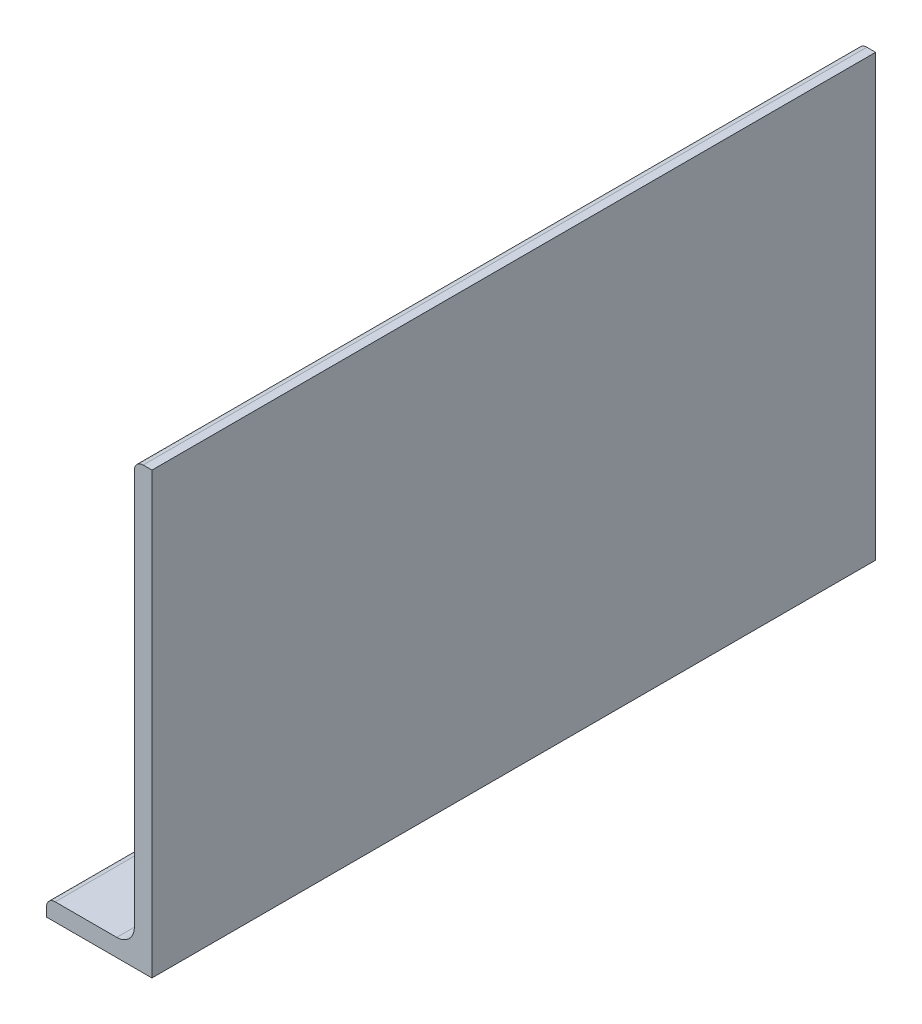
ISO-10303-21;
HEADER;
FILE_DESCRIPTION(('STEP AP214'),'2;1');
FILE_NAME('part.step','',(''),(''),'','','');
FILE_SCHEMA(('AUTOMOTIVE_DESIGN { 1 0 10303 214 1 1 1 1 }'));
ENDSEC;
DATA;
#1=APPLICATION_CONTEXT('core data for automotive mechanical design processes');
#2=APPLICATION_PROTOCOL_DEFINITION('international standard','automotive_design',2000,#1);
#3=PRODUCT_CONTEXT('',#1,'mechanical');
#4=PRODUCT('Part','Part','',(#3));
#5=PRODUCT_RELATED_PRODUCT_CATEGORY('part','',(#4));
#6=PRODUCT_DEFINITION_FORMATION('','',#4);
#7=PRODUCT_DEFINITION_CONTEXT('part definition',#1,'design');
#8=PRODUCT_DEFINITION('design','',#6,#7);
#9=PRODUCT_DEFINITION_SHAPE('','',#8);
#10=(LENGTH_UNIT() NAMED_UNIT(*) SI_UNIT(.MILLI.,.METRE.));
#11=(NAMED_UNIT(*) PLANE_ANGLE_UNIT() SI_UNIT($,.RADIAN.));
#12=(NAMED_UNIT(*) SI_UNIT($,.STERADIAN.) SOLID_ANGLE_UNIT());
#13=UNCERTAINTY_MEASURE_WITH_UNIT(LENGTH_MEASURE(1.E-05),#10,'distance_accuracy_value','');
#14=(GEOMETRIC_REPRESENTATION_CONTEXT(3) GLOBAL_UNCERTAINTY_ASSIGNED_CONTEXT((#13)) GLOBAL_UNIT_ASSIGNED_CONTEXT((#10,
#11,#12)) REPRESENTATION_CONTEXT('',''));
#15=CARTESIAN_POINT('',(0.,0.,0.));
#16=DIRECTION('',(0.,0.,1.));
#17=DIRECTION('',(1.,0.,0.));
#18=AXIS2_PLACEMENT_3D('',#15,#16,#17);
#19=CARTESIAN_POINT('',(466.753002522153,-2.51221530905127,82.26));
#20=DIRECTION('',(0.,-1.,0.));
#21=DIRECTION('',(0.,0.,-1.));
#22=AXIS2_PLACEMENT_3D('',#19,#20,#21);
#23=PLANE('',#22);
#24=DIRECTION('',(-1.,0.,0.));
#25=VECTOR('',#24,1.);
#26=CARTESIAN_POINT('',(466.753002522153,-2.51221530905127,0.));
#27=LINE('',#26,#25);
#28=CARTESIAN_POINT('',(468.753002522153,-2.51221530905127,0.));
#29=VERTEX_POINT('',#28);
#30=CARTESIAN_POINT('',(467.753002522153,-2.51221530905127,0.));
#31=VERTEX_POINT('',#30);
#32=EDGE_CURVE('E135',#29,#31,#27,.T.);
#33=ORIENTED_EDGE('',*,*,#32,.T.);
#34=DIRECTION('',(0.,0.,-1.));
#35=VECTOR('',#34,1.);
#36=CARTESIAN_POINT('',(467.753002522153,-2.51221530905127,82.26));
#37=LINE('',#36,#35);
#38=CARTESIAN_POINT('',(467.753002522153,-2.51221530905127,82.26));
#39=VERTEX_POINT('',#38);
#40=EDGE_CURVE('E167',#31,#39,#37,.F.);
#41=ORIENTED_EDGE('',*,*,#40,.T.);
#42=DIRECTION('',(-1.,0.,0.));
#43=VECTOR('',#42,1.);
#44=CARTESIAN_POINT('',(466.753002522153,-2.51221530905127,82.26));
#45=LINE('',#44,#43);
#46=CARTESIAN_POINT('',(468.753002522153,-2.51221530905127,82.26));
#47=VERTEX_POINT('',#46);
#48=EDGE_CURVE('E148',#47,#39,#45,.T.);
#49=ORIENTED_EDGE('',*,*,#48,.F.);
#50=DIRECTION('',(0.,0.,-1.));
#51=VECTOR('',#50,1.);
#52=CARTESIAN_POINT('',(468.753002522153,-2.51221530905127,82.26));
#53=LINE('',#52,#51);
#54=EDGE_CURVE('E131',#47,#29,#53,.T.);
#55=ORIENTED_EDGE('',*,*,#54,.T.);
#56=EDGE_LOOP('',(#33,#41,#49,#55));
#57=FACE_BOUND('',#56,.T.);
#58=ADVANCED_FACE('F33',(#57),#23,.F.);
#59=CARTESIAN_POINT('',(466.753002522153,-50.5122153090513,82.26));
#60=DIRECTION('',(1.,0.,0.));
#61=DIRECTION('',(0.,0.,-1.));
#62=AXIS2_PLACEMENT_3D('',#59,#60,#61);
#63=PLANE('',#62);
#64=DIRECTION('',(0.,-1.,0.));
#65=VECTOR('',#64,1.);
#66=CARTESIAN_POINT('',(466.753002522153,-50.5122153090513,0.));
#67=LINE('',#66,#65);
#68=CARTESIAN_POINT('',(466.753002522153,-3.51221530905127,0.));
#69=VERTEX_POINT('',#68);
#70=CARTESIAN_POINT('',(466.753002522153,-48.5122153090513,0.));
#71=VERTEX_POINT('',#70);
#72=EDGE_CURVE('E138',#69,#71,#67,.T.);
#73=ORIENTED_EDGE('',*,*,#72,.T.);
#74=DIRECTION('',(0.,0.,-1.));
#75=VECTOR('',#74,1.);
#76=CARTESIAN_POINT('',(466.753002522153,-48.5122153090513,82.26));
#77=LINE('',#76,#75);
#78=CARTESIAN_POINT('',(466.753002522153,-48.5122153090513,82.26));
#79=VERTEX_POINT('',#78);
#80=EDGE_CURVE('E54',#71,#79,#77,.F.);
#81=ORIENTED_EDGE('',*,*,#80,.T.);
#82=DIRECTION('',(0.,-1.,0.));
#83=VECTOR('',#82,1.);
#84=CARTESIAN_POINT('',(466.753002522153,-50.5122153090513,82.26));
#85=LINE('',#84,#83);
#86=CARTESIAN_POINT('',(466.753002522153,-3.51221530905127,82.26));
#87=VERTEX_POINT('',#86);
#88=EDGE_CURVE('E240',#87,#79,#85,.T.);
#89=ORIENTED_EDGE('',*,*,#88,.F.);
#90=DIRECTION('',(0.,0.,-1.));
#91=VECTOR('',#90,1.);
#92=CARTESIAN_POINT('',(466.753002522153,-3.51221530905127,82.26));
#93=LINE('',#92,#91);
#94=EDGE_CURVE('E164',#87,#69,#93,.T.);
#95=ORIENTED_EDGE('',*,*,#94,.T.);
#96=EDGE_LOOP('',(#73,#81,#89,#95));
#97=FACE_BOUND('',#96,.T.);
#98=ADVANCED_FACE('F193',(#97),#63,.F.);
#99=CARTESIAN_POINT('',(456.753002522153,-50.5122153090513,82.26));
#100=DIRECTION('',(0.,-1.,0.));
#101=DIRECTION('',(0.,0.,-1.));
#102=AXIS2_PLACEMENT_3D('',#99,#100,#101);
#103=PLANE('',#102);
#104=CARTESIAN_POINT('',(461.253002522153,-50.5122153090513,67.26));
#105=DIRECTION('',(0.,1.,0.));
#106=DIRECTION('',(0.,0.,1.));
#107=AXIS2_PLACEMENT_3D('',#104,#105,#106);
#108=CIRCLE('',#107,1.59999999999997);
#109=CARTESIAN_POINT('',(461.253002522153,-50.5122153090513,68.86));
#110=VERTEX_POINT('',#109);
#111=EDGE_CURVE('E228',#110,#110,#108,.T.);
#112=ORIENTED_EDGE('',*,*,#111,.F.);
#113=EDGE_LOOP('',(#112));
#114=FACE_BOUND('',#113,.T.);
#115=CARTESIAN_POINT('',(461.253002522153,-50.5122153090513,15.));
#116=DIRECTION('',(0.,1.,0.));
#117=DIRECTION('',(0.,0.,1.));
#118=AXIS2_PLACEMENT_3D('',#115,#116,#117);
#119=CIRCLE('',#118,1.59999999999996);
#120=CARTESIAN_POINT('',(461.253002522153,-50.5122153090513,16.6));
#121=VERTEX_POINT('',#120);
#122=EDGE_CURVE('E233',#121,#121,#119,.T.);
#123=ORIENTED_EDGE('',*,*,#122,.F.);
#124=EDGE_LOOP('',(#123));
#125=FACE_BOUND('',#124,.T.);
#126=DIRECTION('',(-1.,0.,0.));
#127=VECTOR('',#126,1.);
#128=CARTESIAN_POINT('',(456.753002522153,-50.5122153090513,82.26));
#129=LINE('',#128,#127);
#130=CARTESIAN_POINT('',(464.753002522153,-50.5122153090513,82.26));
#131=VERTEX_POINT('',#130);
#132=CARTESIAN_POINT('',(457.753002522153,-50.5122153090513,82.26));
#133=VERTEX_POINT('',#132);
#134=EDGE_CURVE('E114',#131,#133,#129,.T.);
#135=ORIENTED_EDGE('',*,*,#134,.F.);
#136=DIRECTION('',(0.,0.,-1.));
#137=VECTOR('',#136,1.);
#138=CARTESIAN_POINT('',(464.753002522153,-50.5122153090513,0.));
#139=LINE('',#138,#137);
#140=CARTESIAN_POINT('',(464.753002522153,-50.5122153090513,0.));
#141=VERTEX_POINT('',#140);
#142=EDGE_CURVE('E169',#131,#141,#139,.T.);
#143=ORIENTED_EDGE('',*,*,#142,.T.);
#144=DIRECTION('',(-1.,0.,0.));
#145=VECTOR('',#144,1.);
#146=CARTESIAN_POINT('',(456.753002522153,-50.5122153090513,0.));
#147=LINE('',#146,#145);
#148=CARTESIAN_POINT('',(457.753002522153,-50.5122153090513,0.));
#149=VERTEX_POINT('',#148);
#150=EDGE_CURVE('E141',#141,#149,#147,.T.);
#151=ORIENTED_EDGE('',*,*,#150,.T.);
#152=DIRECTION('',(0.,0.,-1.));
#153=VECTOR('',#152,1.);
#154=CARTESIAN_POINT('',(457.753002522153,-50.5122153090513,82.26));
#155=LINE('',#154,#153);
#156=EDGE_CURVE('E158',#149,#133,#155,.F.);
#157=ORIENTED_EDGE('',*,*,#156,.T.);
#158=EDGE_LOOP('',(#135,#143,#151,#157));
#159=FACE_BOUND('',#158,.T.);
#160=ADVANCED_FACE('F175',(#114,#125,#159),#103,.F.);
#161=CARTESIAN_POINT('',(456.753002522153,-52.5122153090513,82.26));
#162=DIRECTION('',(1.,0.,0.));
#163=DIRECTION('',(0.,0.,-1.));
#164=AXIS2_PLACEMENT_3D('',#161,#162,#163);
#165=PLANE('',#164);
#166=DIRECTION('',(0.,-1.,0.));
#167=VECTOR('',#166,1.);
#168=CARTESIAN_POINT('',(456.753002522153,-52.5122153090513,82.26));
#169=LINE('',#168,#167);
#170=CARTESIAN_POINT('',(456.753002522153,-51.5122153090513,82.26));
#171=VERTEX_POINT('',#170);
#172=CARTESIAN_POINT('',(456.753002522153,-52.5122153090513,82.26));
#173=VERTEX_POINT('',#172);
#174=EDGE_CURVE('E103',#171,#173,#169,.T.);
#175=ORIENTED_EDGE('',*,*,#174,.F.);
#176=DIRECTION('',(0.,0.,-1.));
#177=VECTOR('',#176,1.);
#178=CARTESIAN_POINT('',(456.753002522153,-51.5122153090513,82.26));
#179=LINE('',#178,#177);
#180=CARTESIAN_POINT('',(456.753002522153,-51.5122153090513,0.));
#181=VERTEX_POINT('',#180);
#182=EDGE_CURVE('E123',#171,#181,#179,.T.);
#183=ORIENTED_EDGE('',*,*,#182,.T.);
#184=DIRECTION('',(0.,-1.,0.));
#185=VECTOR('',#184,1.);
#186=CARTESIAN_POINT('',(456.753002522153,-52.5122153090513,0.));
#187=LINE('',#186,#185);
#188=CARTESIAN_POINT('',(456.753002522153,-52.5122153090513,0.));
#189=VERTEX_POINT('',#188);
#190=EDGE_CURVE('E120',#181,#189,#187,.T.);
#191=ORIENTED_EDGE('',*,*,#190,.T.);
#192=DIRECTION('',(0.,0.,-1.));
#193=VECTOR('',#192,1.);
#194=CARTESIAN_POINT('',(456.753002522153,-52.5122153090513,82.26));
#195=LINE('',#194,#193);
#196=EDGE_CURVE('E117',#173,#189,#195,.T.);
#197=ORIENTED_EDGE('',*,*,#196,.F.);
#198=EDGE_LOOP('',(#175,#183,#191,#197));
#199=FACE_BOUND('',#198,.T.);
#200=ADVANCED_FACE('F118',(#199),#165,.F.);
#201=CARTESIAN_POINT('',(468.753002522153,-52.5122153090513,82.26));
#202=DIRECTION('',(0.,1.,0.));
#203=DIRECTION('',(0.,0.,1.));
#204=AXIS2_PLACEMENT_3D('',#201,#202,#203);
#205=PLANE('',#204);
#206=CARTESIAN_POINT('',(461.253002522153,-52.5122153090513,67.26));
#207=DIRECTION('',(0.,1.,0.));
#208=DIRECTION('',(0.,0.,1.));
#209=AXIS2_PLACEMENT_3D('',#206,#207,#208);
#210=CIRCLE('',#209,1.59999999999997);
#211=CARTESIAN_POINT('',(461.253002522153,-52.5122153090513,68.86));
#212=VERTEX_POINT('',#211);
#213=EDGE_CURVE('E139',#212,#212,#210,.T.);
#214=ORIENTED_EDGE('',*,*,#213,.T.);
#215=EDGE_LOOP('',(#214));
#216=FACE_BOUND('',#215,.T.);
#217=CARTESIAN_POINT('',(461.253002522153,-52.5122153090513,15.));
#218=DIRECTION('',(0.,1.,0.));
#219=DIRECTION('',(0.,0.,1.));
#220=AXIS2_PLACEMENT_3D('',#217,#218,#219);
#221=CIRCLE('',#220,1.59999999999996);
#222=CARTESIAN_POINT('',(461.253002522153,-52.5122153090513,16.6));
#223=VERTEX_POINT('',#222);
#224=EDGE_CURVE('E229',#223,#223,#221,.T.);
#225=ORIENTED_EDGE('',*,*,#224,.T.);
#226=EDGE_LOOP('',(#225));
#227=FACE_BOUND('',#226,.T.);
#228=DIRECTION('',(1.,0.,0.));
#229=VECTOR('',#228,1.);
#230=CARTESIAN_POINT('',(468.753002522153,-52.5122153090513,0.));
#231=LINE('',#230,#229);
#232=CARTESIAN_POINT('',(468.753002522153,-52.5122153090513,0.));
#233=VERTEX_POINT('',#232);
#234=EDGE_CURVE('E144',#189,#233,#231,.T.);
#235=ORIENTED_EDGE('',*,*,#234,.T.);
#236=DIRECTION('',(0.,0.,-1.));
#237=VECTOR('',#236,1.);
#238=CARTESIAN_POINT('',(468.753002522153,-52.5122153090513,82.26));
#239=LINE('',#238,#237);
#240=CARTESIAN_POINT('',(468.753002522153,-52.5122153090513,82.26));
#241=VERTEX_POINT('',#240);
#242=EDGE_CURVE('E124',#241,#233,#239,.T.);
#243=ORIENTED_EDGE('',*,*,#242,.F.);
#244=DIRECTION('',(1.,0.,0.));
#245=VECTOR('',#244,1.);
#246=CARTESIAN_POINT('',(468.753002522153,-52.5122153090513,82.26));
#247=LINE('',#246,#245);
#248=EDGE_CURVE('E107',#173,#241,#247,.T.);
#249=ORIENTED_EDGE('',*,*,#248,.F.);
#250=ORIENTED_EDGE('',*,*,#196,.T.);
#251=EDGE_LOOP('',(#235,#243,#249,#250));
#252=FACE_BOUND('',#251,.T.);
#253=ADVANCED_FACE('F126',(#216,#227,#252),#205,.F.);
#254=CARTESIAN_POINT('',(468.753002522153,-2.51221530905127,82.26));
#255=DIRECTION('',(-1.,0.,0.));
#256=DIRECTION('',(0.,0.,1.));
#257=AXIS2_PLACEMENT_3D('',#254,#255,#256);
#258=PLANE('',#257);
#259=DIRECTION('',(0.,1.,0.));
#260=VECTOR('',#259,1.);
#261=CARTESIAN_POINT('',(468.753002522153,-2.51221530905127,0.));
#262=LINE('',#261,#260);
#263=EDGE_CURVE('E146',#233,#29,#262,.T.);
#264=ORIENTED_EDGE('',*,*,#263,.T.);
#265=ORIENTED_EDGE('',*,*,#54,.F.);
#266=DIRECTION('',(0.,1.,0.));
#267=VECTOR('',#266,1.);
#268=CARTESIAN_POINT('',(468.753002522153,-2.51221530905127,82.26));
#269=LINE('',#268,#267);
#270=EDGE_CURVE('E129',#241,#47,#269,.T.);
#271=ORIENTED_EDGE('',*,*,#270,.F.);
#272=ORIENTED_EDGE('',*,*,#242,.T.);
#273=EDGE_LOOP('',(#264,#265,#271,#272));
#274=FACE_BOUND('',#273,.T.);
#275=ADVANCED_FACE('F207',(#274),#258,.F.);
#276=CARTESIAN_POINT('',(0.,0.,82.26));
#277=DIRECTION('',(0.,0.,-1.));
#278=DIRECTION('',(-1.,0.,0.));
#279=AXIS2_PLACEMENT_3D('',#276,#277,#278);
#280=PLANE('',#279);
#281=ORIENTED_EDGE('',*,*,#88,.T.);
#282=CARTESIAN_POINT('',(464.753002522153,-48.5122153090513,82.26));
#283=DIRECTION('',(0.,0.,-1.));
#284=DIRECTION('',(-1.,0.,0.));
#285=AXIS2_PLACEMENT_3D('',#282,#283,#284);
#286=CIRCLE('',#285,2.);
#287=EDGE_CURVE('E11',#79,#131,#286,.T.);
#288=ORIENTED_EDGE('',*,*,#287,.T.);
#289=ORIENTED_EDGE('',*,*,#134,.T.);
#290=CARTESIAN_POINT('',(457.753002522153,-51.5122153090513,82.26));
#291=DIRECTION('',(0.,0.,-1.));
#292=DIRECTION('',(-1.,0.,0.));
#293=AXIS2_PLACEMENT_3D('',#290,#291,#292);
#294=CIRCLE('',#293,1.);
#295=EDGE_CURVE('E110',#133,#171,#294,.F.);
#296=ORIENTED_EDGE('',*,*,#295,.T.);
#297=ORIENTED_EDGE('',*,*,#174,.T.);
#298=ORIENTED_EDGE('',*,*,#248,.T.);
#299=ORIENTED_EDGE('',*,*,#270,.T.);
#300=ORIENTED_EDGE('',*,*,#48,.T.);
#301=CARTESIAN_POINT('',(467.753002522153,-3.51221530905127,82.26));
#302=DIRECTION('',(0.,0.,-1.));
#303=DIRECTION('',(-1.,0.,0.));
#304=AXIS2_PLACEMENT_3D('',#301,#302,#303);
#305=CIRCLE('',#304,1.);
#306=EDGE_CURVE('E161',#39,#87,#305,.F.);
#307=ORIENTED_EDGE('',*,*,#306,.T.);
#308=EDGE_LOOP('',(#281,#288,#289,#296,#297,#298,#299,#300,#307));
#309=FACE_BOUND('',#308,.T.);
#310=ADVANCED_FACE('F105',(#309),#280,.F.);
#311=CARTESIAN_POINT('',(0.,0.,0.));
#312=DIRECTION('',(0.,0.,-1.));
#313=DIRECTION('',(-1.,0.,0.));
#314=AXIS2_PLACEMENT_3D('',#311,#312,#313);
#315=PLANE('',#314);
#316=ORIENTED_EDGE('',*,*,#190,.F.);
#317=CARTESIAN_POINT('',(457.753002522153,-51.5122153090513,0.));
#318=DIRECTION('',(0.,0.,-1.));
#319=DIRECTION('',(-1.,0.,0.));
#320=AXIS2_PLACEMENT_3D('',#317,#318,#319);
#321=CIRCLE('',#320,1.);
#322=EDGE_CURVE('E155',#181,#149,#321,.T.);
#323=ORIENTED_EDGE('',*,*,#322,.T.);
#324=ORIENTED_EDGE('',*,*,#150,.F.);
#325=CARTESIAN_POINT('',(464.753002522153,-48.5122153090513,0.));
#326=DIRECTION('',(0.,0.,-1.));
#327=DIRECTION('',(-1.,0.,0.));
#328=AXIS2_PLACEMENT_3D('',#325,#326,#327);
#329=CIRCLE('',#328,2.);
#330=EDGE_CURVE('E41',#141,#71,#329,.F.);
#331=ORIENTED_EDGE('',*,*,#330,.T.);
#332=ORIENTED_EDGE('',*,*,#72,.F.);
#333=CARTESIAN_POINT('',(467.753002522153,-3.51221530905127,0.));
#334=DIRECTION('',(0.,0.,-1.));
#335=DIRECTION('',(-1.,0.,0.));
#336=AXIS2_PLACEMENT_3D('',#333,#334,#335);
#337=CIRCLE('',#336,1.);
#338=EDGE_CURVE('E153',#69,#31,#337,.T.);
#339=ORIENTED_EDGE('',*,*,#338,.T.);
#340=ORIENTED_EDGE('',*,*,#32,.F.);
#341=ORIENTED_EDGE('',*,*,#263,.F.);
#342=ORIENTED_EDGE('',*,*,#234,.F.);
#343=EDGE_LOOP('',(#316,#323,#324,#331,#332,#339,#340,#341,#342));
#344=FACE_BOUND('',#343,.T.);
#345=ADVANCED_FACE('F178',(#344),#315,.T.);
#346=CARTESIAN_POINT('',(457.753002522153,-51.5122153090513,82.26));
#347=DIRECTION('',(0.,0.,-1.));
#348=DIRECTION('',(-1.,0.,0.));
#349=AXIS2_PLACEMENT_3D('',#346,#347,#348);
#350=CYLINDRICAL_SURFACE('',#349,1.);
#351=ORIENTED_EDGE('',*,*,#295,.F.);
#352=ORIENTED_EDGE('',*,*,#156,.F.);
#353=ORIENTED_EDGE('',*,*,#322,.F.);
#354=ORIENTED_EDGE('',*,*,#182,.F.);
#355=EDGE_LOOP('',(#351,#352,#353,#354));
#356=FACE_BOUND('',#355,.T.);
#357=ADVANCED_FACE('F181',(#356),#350,.T.);
#358=CARTESIAN_POINT('',(467.753002522153,-3.51221530905127,82.26));
#359=DIRECTION('',(0.,0.,-1.));
#360=DIRECTION('',(-1.,0.,0.));
#361=AXIS2_PLACEMENT_3D('',#358,#359,#360);
#362=CYLINDRICAL_SURFACE('',#361,1.);
#363=ORIENTED_EDGE('',*,*,#306,.F.);
#364=ORIENTED_EDGE('',*,*,#40,.F.);
#365=ORIENTED_EDGE('',*,*,#338,.F.);
#366=ORIENTED_EDGE('',*,*,#94,.F.);
#367=EDGE_LOOP('',(#363,#364,#365,#366));
#368=FACE_BOUND('',#367,.T.);
#369=ADVANCED_FACE('F183',(#368),#362,.T.);
#370=CARTESIAN_POINT('',(464.753002522153,-48.5122153090513,82.26));
#371=DIRECTION('',(0.,0.,1.));
#372=DIRECTION('',(1.,0.,0.));
#373=AXIS2_PLACEMENT_3D('',#370,#371,#372);
#374=CYLINDRICAL_SURFACE('',#373,2.);
#375=ORIENTED_EDGE('',*,*,#287,.F.);
#376=ORIENTED_EDGE('',*,*,#80,.F.);
#377=ORIENTED_EDGE('',*,*,#330,.F.);
#378=ORIENTED_EDGE('',*,*,#142,.F.);
#379=EDGE_LOOP('',(#375,#376,#377,#378));
#380=FACE_BOUND('',#379,.T.);
#381=ADVANCED_FACE('F35',(#380),#374,.F.);
#382=CARTESIAN_POINT('',(461.253002522153,-52.5122153090513,15.));
#383=DIRECTION('',(0.,1.,0.));
#384=DIRECTION('',(0.,0.,1.));
#385=AXIS2_PLACEMENT_3D('',#382,#383,#384);
#386=CYLINDRICAL_SURFACE('',#385,1.59999999999996);
#387=ORIENTED_EDGE('',*,*,#224,.F.);
#388=EDGE_LOOP('',(#387));
#389=FACE_BOUND('',#388,.T.);
#390=ORIENTED_EDGE('',*,*,#122,.T.);
#391=EDGE_LOOP('',(#390));
#392=FACE_BOUND('',#391,.T.);
#393=ADVANCED_FACE('F214',(#389,#392),#386,.F.);
#394=CARTESIAN_POINT('',(461.253002522153,-52.5122153090513,67.26));
#395=DIRECTION('',(0.,1.,0.));
#396=DIRECTION('',(0.,0.,1.));
#397=AXIS2_PLACEMENT_3D('',#394,#395,#396);
#398=CYLINDRICAL_SURFACE('',#397,1.59999999999997);
#399=ORIENTED_EDGE('',*,*,#213,.F.);
#400=EDGE_LOOP('',(#399));
#401=FACE_BOUND('',#400,.T.);
#402=ORIENTED_EDGE('',*,*,#111,.T.);
#403=EDGE_LOOP('',(#402));
#404=FACE_BOUND('',#403,.T.);
#405=ADVANCED_FACE('F217',(#401,#404),#398,.F.);
#406=CLOSED_SHELL('',(#58,#98,#160,#200,#253,#275,#310,#345,#357,#369,#381,#393,#405));
#407=MANIFOLD_SOLID_BREP('B2',#406);
#408=ADVANCED_BREP_SHAPE_REPRESENTATION('',(#18,#407),#14);
#409=SHAPE_DEFINITION_REPRESENTATION(#9,#408);
ENDSEC;
END-ISO-10303-21;
